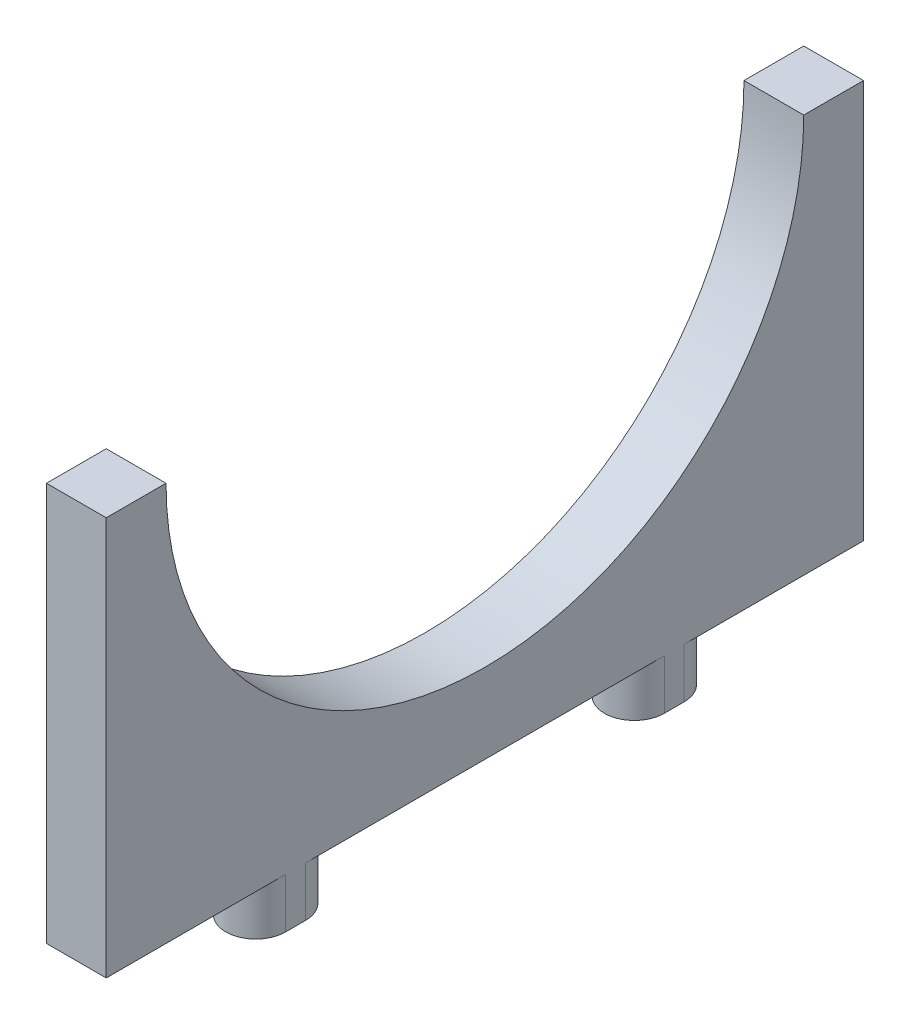
ISO-10303-21;
HEADER;
FILE_DESCRIPTION(('STEP AP214'),'2;1');
FILE_NAME('part.step','',(''),(''),'','','');
FILE_SCHEMA(('AUTOMOTIVE_DESIGN { 1 0 10303 214 1 1 1 1 }'));
ENDSEC;
DATA;
#1=APPLICATION_CONTEXT('core data for automotive mechanical design processes');
#2=APPLICATION_PROTOCOL_DEFINITION('international standard','automotive_design',2000,#1);
#3=PRODUCT_CONTEXT('',#1,'mechanical');
#4=PRODUCT('Part','Part','',(#3));
#5=PRODUCT_RELATED_PRODUCT_CATEGORY('part','',(#4));
#6=PRODUCT_DEFINITION_FORMATION('','',#4);
#7=PRODUCT_DEFINITION_CONTEXT('part definition',#1,'design');
#8=PRODUCT_DEFINITION('design','',#6,#7);
#9=PRODUCT_DEFINITION_SHAPE('','',#8);
#10=(LENGTH_UNIT() NAMED_UNIT(*) SI_UNIT(.MILLI.,.METRE.));
#11=(NAMED_UNIT(*) PLANE_ANGLE_UNIT() SI_UNIT($,.RADIAN.));
#12=(NAMED_UNIT(*) SI_UNIT($,.STERADIAN.) SOLID_ANGLE_UNIT());
#13=UNCERTAINTY_MEASURE_WITH_UNIT(LENGTH_MEASURE(1.E-05),#10,'distance_accuracy_value','');
#14=(GEOMETRIC_REPRESENTATION_CONTEXT(3) GLOBAL_UNCERTAINTY_ASSIGNED_CONTEXT((#13)) GLOBAL_UNIT_ASSIGNED_CONTEXT((#10,
#11,#12)) REPRESENTATION_CONTEXT('',''));
#15=CARTESIAN_POINT('',(0.,0.,0.));
#16=DIRECTION('',(0.,0.,1.));
#17=DIRECTION('',(1.,0.,0.));
#18=AXIS2_PLACEMENT_3D('',#15,#16,#17);
#19=CARTESIAN_POINT('',(6.,-40.,38.));
#20=DIRECTION('',(0.,1.,0.));
#21=DIRECTION('',(0.,0.,1.));
#22=AXIS2_PLACEMENT_3D('',#19,#20,#21);
#23=PLANE('',#22);
#24=CARTESIAN_POINT('',(3.,-40.,-20.));
#25=DIRECTION('',(0.,-1.,0.));
#26=DIRECTION('',(0.,0.,-1.));
#27=AXIS2_PLACEMENT_3D('',#24,#25,#26);
#28=CIRCLE('',#27,3.);
#29=CARTESIAN_POINT('',(0.,-40.,-20.));
#30=VERTEX_POINT('',#29);
#31=CARTESIAN_POINT('',(6.,-40.,-20.));
#32=VERTEX_POINT('',#31);
#33=EDGE_CURVE('E156',#30,#32,#28,.T.);
#34=ORIENTED_EDGE('',*,*,#33,.F.);
#35=DIRECTION('',(0.,0.,-1.));
#36=VECTOR('',#35,1.);
#37=CARTESIAN_POINT('',(0.,-40.,38.));
#38=LINE('',#37,#36);
#39=CARTESIAN_POINT('',(0.,-40.,-38.));
#40=VERTEX_POINT('',#39);
#41=EDGE_CURVE('E208',#30,#40,#38,.T.);
#42=ORIENTED_EDGE('',*,*,#41,.T.);
#43=DIRECTION('',(-1.,0.,0.));
#44=VECTOR('',#43,1.);
#45=CARTESIAN_POINT('',(6.,-40.,-38.));
#46=LINE('',#45,#44);
#47=CARTESIAN_POINT('',(6.,-40.,-38.));
#48=VERTEX_POINT('',#47);
#49=EDGE_CURVE('E40',#48,#40,#46,.T.);
#50=ORIENTED_EDGE('',*,*,#49,.F.);
#51=DIRECTION('',(0.,0.,-1.));
#52=VECTOR('',#51,1.);
#53=CARTESIAN_POINT('',(6.,-40.,38.));
#54=LINE('',#53,#52);
#55=EDGE_CURVE('E47',#32,#48,#54,.T.);
#56=ORIENTED_EDGE('',*,*,#55,.F.);
#57=EDGE_LOOP('',(#34,#42,#50,#56));
#58=FACE_BOUND('',#57,.T.);
#59=ADVANCED_FACE('F32',(#58),#23,.F.);
#60=CARTESIAN_POINT('',(3.,-40.,-18.));
#61=DIRECTION('',(0.,-1.,0.));
#62=DIRECTION('',(0.,0.,-1.));
#63=AXIS2_PLACEMENT_3D('',#60,#61,#62);
#64=CIRCLE('',#63,3.);
#65=CARTESIAN_POINT('',(6.,-40.,-18.));
#66=VERTEX_POINT('',#65);
#67=CARTESIAN_POINT('',(0.,-40.,-18.));
#68=VERTEX_POINT('',#67);
#69=EDGE_CURVE('E55',#66,#68,#64,.T.);
#70=ORIENTED_EDGE('',*,*,#69,.F.);
#71=CARTESIAN_POINT('',(6.,-40.,18.));
#72=VERTEX_POINT('',#71);
#73=EDGE_CURVE('E197',#72,#66,#54,.T.);
#74=ORIENTED_EDGE('',*,*,#73,.F.);
#75=CARTESIAN_POINT('',(3.,-40.,18.));
#76=DIRECTION('',(0.,-1.,0.));
#77=DIRECTION('',(0.,0.,-1.));
#78=AXIS2_PLACEMENT_3D('',#75,#76,#77);
#79=CIRCLE('',#78,3.);
#80=CARTESIAN_POINT('',(0.,-40.,18.));
#81=VERTEX_POINT('',#80);
#82=EDGE_CURVE('E157',#81,#72,#79,.T.);
#83=ORIENTED_EDGE('',*,*,#82,.F.);
#84=EDGE_CURVE('E212',#81,#68,#38,.T.);
#85=ORIENTED_EDGE('',*,*,#84,.T.);
#86=EDGE_LOOP('',(#70,#74,#83,#85));
#87=FACE_BOUND('',#86,.T.);
#88=ADVANCED_FACE('F292',(#87),#23,.F.);
#89=CARTESIAN_POINT('',(6.,0.,38.));
#90=DIRECTION('',(0.,0.,-1.));
#91=DIRECTION('',(0.,1.,0.));
#92=AXIS2_PLACEMENT_3D('',#89,#90,#91);
#93=PLANE('',#92);
#94=DIRECTION('',(0.,-1.,0.));
#95=VECTOR('',#94,1.);
#96=CARTESIAN_POINT('',(0.,0.,38.));
#97=LINE('',#96,#95);
#98=CARTESIAN_POINT('',(0.,0.,38.));
#99=VERTEX_POINT('',#98);
#100=CARTESIAN_POINT('',(0.,-40.,38.));
#101=VERTEX_POINT('',#100);
#102=EDGE_CURVE('E189',#99,#101,#97,.T.);
#103=ORIENTED_EDGE('',*,*,#102,.T.);
#104=DIRECTION('',(-1.,0.,0.));
#105=VECTOR('',#104,1.);
#106=CARTESIAN_POINT('',(6.,-40.,38.));
#107=LINE('',#106,#105);
#108=CARTESIAN_POINT('',(6.,-40.,38.));
#109=VERTEX_POINT('',#108);
#110=EDGE_CURVE('E11',#109,#101,#107,.T.);
#111=ORIENTED_EDGE('',*,*,#110,.F.);
#112=DIRECTION('',(0.,-1.,0.));
#113=VECTOR('',#112,1.);
#114=CARTESIAN_POINT('',(6.,0.,38.));
#115=LINE('',#114,#113);
#116=CARTESIAN_POINT('',(6.,0.,38.));
#117=VERTEX_POINT('',#116);
#118=EDGE_CURVE('E190',#117,#109,#115,.T.);
#119=ORIENTED_EDGE('',*,*,#118,.F.);
#120=DIRECTION('',(-1.,0.,0.));
#121=VECTOR('',#120,1.);
#122=CARTESIAN_POINT('',(6.,0.,38.));
#123=LINE('',#122,#121);
#124=EDGE_CURVE('E205',#117,#99,#123,.T.);
#125=ORIENTED_EDGE('',*,*,#124,.T.);
#126=EDGE_LOOP('',(#103,#111,#119,#125));
#127=FACE_BOUND('',#126,.T.);
#128=ADVANCED_FACE('F34',(#127),#93,.F.);
#129=CARTESIAN_POINT('',(3.,-40.,20.));
#130=DIRECTION('',(0.,-1.,0.));
#131=DIRECTION('',(0.,0.,-1.));
#132=AXIS2_PLACEMENT_3D('',#129,#130,#131);
#133=CIRCLE('',#132,3.);
#134=CARTESIAN_POINT('',(6.,-40.,20.));
#135=VERTEX_POINT('',#134);
#136=CARTESIAN_POINT('',(0.,-40.,20.));
#137=VERTEX_POINT('',#136);
#138=EDGE_CURVE('E160',#135,#137,#133,.T.);
#139=ORIENTED_EDGE('',*,*,#138,.F.);
#140=EDGE_CURVE('E193',#109,#135,#54,.T.);
#141=ORIENTED_EDGE('',*,*,#140,.F.);
#142=ORIENTED_EDGE('',*,*,#110,.T.);
#143=EDGE_CURVE('E209',#101,#137,#38,.T.);
#144=ORIENTED_EDGE('',*,*,#143,.T.);
#145=EDGE_LOOP('',(#139,#141,#142,#144));
#146=FACE_BOUND('',#145,.T.);
#147=ADVANCED_FACE('F276',(#146),#23,.F.);
#148=CARTESIAN_POINT('',(6.,0.,-38.));
#149=DIRECTION('',(0.,0.,1.));
#150=DIRECTION('',(0.,-1.,0.));
#151=AXIS2_PLACEMENT_3D('',#148,#149,#150);
#152=PLANE('',#151);
#153=DIRECTION('',(0.,1.,0.));
#154=VECTOR('',#153,1.);
#155=CARTESIAN_POINT('',(0.,0.,-38.));
#156=LINE('',#155,#154);
#157=CARTESIAN_POINT('',(0.,0.,-38.));
#158=VERTEX_POINT('',#157);
#159=EDGE_CURVE('E211',#40,#158,#156,.T.);
#160=ORIENTED_EDGE('',*,*,#159,.T.);
#161=DIRECTION('',(-1.,0.,0.));
#162=VECTOR('',#161,1.);
#163=CARTESIAN_POINT('',(6.,0.,-38.));
#164=LINE('',#163,#162);
#165=CARTESIAN_POINT('',(6.,0.,-38.));
#166=VERTEX_POINT('',#165);
#167=EDGE_CURVE('E227',#166,#158,#164,.T.);
#168=ORIENTED_EDGE('',*,*,#167,.F.);
#169=DIRECTION('',(0.,1.,0.));
#170=VECTOR('',#169,1.);
#171=CARTESIAN_POINT('',(6.,0.,-38.));
#172=LINE('',#171,#170);
#173=EDGE_CURVE('E196',#48,#166,#172,.T.);
#174=ORIENTED_EDGE('',*,*,#173,.F.);
#175=ORIENTED_EDGE('',*,*,#49,.T.);
#176=EDGE_LOOP('',(#160,#168,#174,#175));
#177=FACE_BOUND('',#176,.T.);
#178=ADVANCED_FACE('F233',(#177),#152,.F.);
#179=CARTESIAN_POINT('',(6.,0.,-32.));
#180=DIRECTION('',(0.,-1.,0.));
#181=DIRECTION('',(0.,0.,-1.));
#182=AXIS2_PLACEMENT_3D('',#179,#180,#181);
#183=PLANE('',#182);
#184=DIRECTION('',(0.,0.,1.));
#185=VECTOR('',#184,1.);
#186=CARTESIAN_POINT('',(0.,0.,-32.));
#187=LINE('',#186,#185);
#188=CARTESIAN_POINT('',(0.,0.,-32.));
#189=VERTEX_POINT('',#188);
#190=EDGE_CURVE('E214',#158,#189,#187,.T.);
#191=ORIENTED_EDGE('',*,*,#190,.T.);
#192=DIRECTION('',(-1.,0.,0.));
#193=VECTOR('',#192,1.);
#194=CARTESIAN_POINT('',(6.,0.,-32.));
#195=LINE('',#194,#193);
#196=CARTESIAN_POINT('',(6.,0.,-32.));
#197=VERTEX_POINT('',#196);
#198=EDGE_CURVE('E224',#197,#189,#195,.T.);
#199=ORIENTED_EDGE('',*,*,#198,.F.);
#200=DIRECTION('',(0.,0.,1.));
#201=VECTOR('',#200,1.);
#202=CARTESIAN_POINT('',(6.,0.,-32.));
#203=LINE('',#202,#201);
#204=EDGE_CURVE('E199',#166,#197,#203,.T.);
#205=ORIENTED_EDGE('',*,*,#204,.F.);
#206=ORIENTED_EDGE('',*,*,#167,.T.);
#207=EDGE_LOOP('',(#191,#199,#205,#206));
#208=FACE_BOUND('',#207,.T.);
#209=ADVANCED_FACE('F243',(#208),#183,.F.);
#210=CARTESIAN_POINT('',(6.,0.,0.));
#211=DIRECTION('',(-1.,0.,0.));
#212=DIRECTION('',(0.,0.,1.));
#213=AXIS2_PLACEMENT_3D('',#210,#211,#212);
#214=CYLINDRICAL_SURFACE('',#213,32.);
#215=CARTESIAN_POINT('',(0.,0.,0.));
#216=DIRECTION('',(-1.,0.,0.));
#217=DIRECTION('',(0.,0.,-1.));
#218=AXIS2_PLACEMENT_3D('',#215,#216,#217);
#219=CIRCLE('',#218,32.);
#220=CARTESIAN_POINT('',(0.,0.,32.));
#221=VERTEX_POINT('',#220);
#222=EDGE_CURVE('E216',#189,#221,#219,.T.);
#223=ORIENTED_EDGE('',*,*,#222,.T.);
#224=DIRECTION('',(-1.,0.,0.));
#225=VECTOR('',#224,1.);
#226=CARTESIAN_POINT('',(6.,0.,32.));
#227=LINE('',#226,#225);
#228=CARTESIAN_POINT('',(6.,0.,32.));
#229=VERTEX_POINT('',#228);
#230=EDGE_CURVE('E221',#229,#221,#227,.T.);
#231=ORIENTED_EDGE('',*,*,#230,.F.);
#232=CARTESIAN_POINT('',(6.,0.,0.));
#233=DIRECTION('',(-1.,0.,0.));
#234=DIRECTION('',(0.,0.,-1.));
#235=AXIS2_PLACEMENT_3D('',#232,#233,#234);
#236=CIRCLE('',#235,32.);
#237=EDGE_CURVE('E201',#197,#229,#236,.T.);
#238=ORIENTED_EDGE('',*,*,#237,.F.);
#239=ORIENTED_EDGE('',*,*,#198,.T.);
#240=EDGE_LOOP('',(#223,#231,#238,#239));
#241=FACE_BOUND('',#240,.T.);
#242=ADVANCED_FACE('F247',(#241),#214,.F.);
#243=CARTESIAN_POINT('',(6.,0.,38.));
#244=DIRECTION('',(0.,-1.,0.));
#245=DIRECTION('',(0.,0.,-1.));
#246=AXIS2_PLACEMENT_3D('',#243,#244,#245);
#247=PLANE('',#246);
#248=DIRECTION('',(0.,0.,1.));
#249=VECTOR('',#248,1.);
#250=CARTESIAN_POINT('',(0.,0.,38.));
#251=LINE('',#250,#249);
#252=EDGE_CURVE('E192',#221,#99,#251,.T.);
#253=ORIENTED_EDGE('',*,*,#252,.T.);
#254=ORIENTED_EDGE('',*,*,#124,.F.);
#255=DIRECTION('',(0.,0.,1.));
#256=VECTOR('',#255,1.);
#257=CARTESIAN_POINT('',(6.,0.,38.));
#258=LINE('',#257,#256);
#259=EDGE_CURVE('E203',#229,#117,#258,.T.);
#260=ORIENTED_EDGE('',*,*,#259,.F.);
#261=ORIENTED_EDGE('',*,*,#230,.T.);
#262=EDGE_LOOP('',(#253,#254,#260,#261));
#263=FACE_BOUND('',#262,.T.);
#264=ADVANCED_FACE('F281',(#263),#247,.F.);
#265=CARTESIAN_POINT('',(6.,0.,0.));
#266=DIRECTION('',(1.,0.,0.));
#267=DIRECTION('',(0.,0.,-1.));
#268=AXIS2_PLACEMENT_3D('',#265,#266,#267);
#269=PLANE('',#268);
#270=ORIENTED_EDGE('',*,*,#118,.T.);
#271=ORIENTED_EDGE('',*,*,#140,.T.);
#272=DIRECTION('',(0.,1.,0.));
#273=VECTOR('',#272,1.);
#274=CARTESIAN_POINT('',(6.,-45.,20.));
#275=LINE('',#274,#273);
#276=CARTESIAN_POINT('',(6.,-45.,20.));
#277=VERTEX_POINT('',#276);
#278=EDGE_CURVE('E183',#277,#135,#275,.T.);
#279=ORIENTED_EDGE('',*,*,#278,.F.);
#280=DIRECTION('',(0.,0.,1.));
#281=VECTOR('',#280,1.);
#282=CARTESIAN_POINT('',(6.,-45.,20.));
#283=LINE('',#282,#281);
#284=CARTESIAN_POINT('',(6.,-45.,18.));
#285=VERTEX_POINT('',#284);
#286=EDGE_CURVE('E169',#285,#277,#283,.T.);
#287=ORIENTED_EDGE('',*,*,#286,.F.);
#288=DIRECTION('',(0.,1.,0.));
#289=VECTOR('',#288,1.);
#290=CARTESIAN_POINT('',(6.,-45.,18.));
#291=LINE('',#290,#289);
#292=EDGE_CURVE('E186',#285,#72,#291,.T.);
#293=ORIENTED_EDGE('',*,*,#292,.T.);
#294=ORIENTED_EDGE('',*,*,#73,.T.);
#295=DIRECTION('',(0.,1.,0.));
#296=VECTOR('',#295,1.);
#297=CARTESIAN_POINT('',(6.,-45.,-18.));
#298=LINE('',#297,#296);
#299=CARTESIAN_POINT('',(6.,-45.,-18.));
#300=VERTEX_POINT('',#299);
#301=EDGE_CURVE('E141',#300,#66,#298,.T.);
#302=ORIENTED_EDGE('',*,*,#301,.F.);
#303=DIRECTION('',(0.,0.,1.));
#304=VECTOR('',#303,1.);
#305=CARTESIAN_POINT('',(6.,-45.,-18.));
#306=LINE('',#305,#304);
#307=CARTESIAN_POINT('',(6.,-45.,-20.));
#308=VERTEX_POINT('',#307);
#309=EDGE_CURVE('E133',#308,#300,#306,.T.);
#310=ORIENTED_EDGE('',*,*,#309,.F.);
#311=DIRECTION('',(0.,1.,0.));
#312=VECTOR('',#311,1.);
#313=CARTESIAN_POINT('',(6.,-45.,-20.));
#314=LINE('',#313,#312);
#315=EDGE_CURVE('E138',#308,#32,#314,.T.);
#316=ORIENTED_EDGE('',*,*,#315,.T.);
#317=ORIENTED_EDGE('',*,*,#55,.T.);
#318=ORIENTED_EDGE('',*,*,#173,.T.);
#319=ORIENTED_EDGE('',*,*,#204,.T.);
#320=ORIENTED_EDGE('',*,*,#237,.T.);
#321=ORIENTED_EDGE('',*,*,#259,.T.);
#322=EDGE_LOOP('',(#270,#271,#279,#287,#293,#294,#302,#310,#316,#317,#318,#319,#320,#321));
#323=FACE_BOUND('',#322,.T.);
#324=ADVANCED_FACE('F136',(#323),#269,.T.);
#325=CARTESIAN_POINT('',(0.,0.,0.));
#326=DIRECTION('',(1.,0.,0.));
#327=DIRECTION('',(0.,0.,-1.));
#328=AXIS2_PLACEMENT_3D('',#325,#326,#327);
#329=PLANE('',#328);
#330=ORIENTED_EDGE('',*,*,#102,.F.);
#331=ORIENTED_EDGE('',*,*,#252,.F.);
#332=ORIENTED_EDGE('',*,*,#222,.F.);
#333=ORIENTED_EDGE('',*,*,#190,.F.);
#334=ORIENTED_EDGE('',*,*,#159,.F.);
#335=ORIENTED_EDGE('',*,*,#41,.F.);
#336=DIRECTION('',(0.,1.,0.));
#337=VECTOR('',#336,1.);
#338=CARTESIAN_POINT('',(0.,-45.,-20.));
#339=LINE('',#338,#337);
#340=CARTESIAN_POINT('',(0.,-45.,-20.));
#341=VERTEX_POINT('',#340);
#342=EDGE_CURVE('E257',#341,#30,#339,.T.);
#343=ORIENTED_EDGE('',*,*,#342,.F.);
#344=DIRECTION('',(0.,0.,-1.));
#345=VECTOR('',#344,1.);
#346=CARTESIAN_POINT('',(0.,-45.,-18.));
#347=LINE('',#346,#345);
#348=CARTESIAN_POINT('',(0.,-45.,-18.));
#349=VERTEX_POINT('',#348);
#350=EDGE_CURVE('E150',#349,#341,#347,.T.);
#351=ORIENTED_EDGE('',*,*,#350,.F.);
#352=DIRECTION('',(0.,1.,0.));
#353=VECTOR('',#352,1.);
#354=CARTESIAN_POINT('',(0.,-45.,-18.));
#355=LINE('',#354,#353);
#356=EDGE_CURVE('E162',#349,#68,#355,.T.);
#357=ORIENTED_EDGE('',*,*,#356,.T.);
#358=ORIENTED_EDGE('',*,*,#84,.F.);
#359=DIRECTION('',(0.,1.,0.));
#360=VECTOR('',#359,1.);
#361=CARTESIAN_POINT('',(0.,-45.,18.));
#362=LINE('',#361,#360);
#363=CARTESIAN_POINT('',(0.,-45.,18.));
#364=VERTEX_POINT('',#363);
#365=EDGE_CURVE('E174',#364,#81,#362,.T.);
#366=ORIENTED_EDGE('',*,*,#365,.F.);
#367=DIRECTION('',(0.,0.,-1.));
#368=VECTOR('',#367,1.);
#369=CARTESIAN_POINT('',(0.,-45.,20.));
#370=LINE('',#369,#368);
#371=CARTESIAN_POINT('',(0.,-45.,20.));
#372=VERTEX_POINT('',#371);
#373=EDGE_CURVE('E173',#372,#364,#370,.T.);
#374=ORIENTED_EDGE('',*,*,#373,.F.);
#375=DIRECTION('',(0.,1.,0.));
#376=VECTOR('',#375,1.);
#377=CARTESIAN_POINT('',(0.,-45.,20.));
#378=LINE('',#377,#376);
#379=EDGE_CURVE('E180',#372,#137,#378,.T.);
#380=ORIENTED_EDGE('',*,*,#379,.T.);
#381=ORIENTED_EDGE('',*,*,#143,.F.);
#382=EDGE_LOOP('',(#330,#331,#332,#333,#334,#335,#343,#351,#357,#358,#366,#374,#380,#381));
#383=FACE_BOUND('',#382,.T.);
#384=ADVANCED_FACE('F238',(#383),#329,.F.);
#385=CARTESIAN_POINT('',(3.,-45.,18.));
#386=DIRECTION('',(0.,1.,0.));
#387=DIRECTION('',(0.,0.,1.));
#388=AXIS2_PLACEMENT_3D('',#385,#386,#387);
#389=CYLINDRICAL_SURFACE('',#388,3.);
#390=ORIENTED_EDGE('',*,*,#82,.T.);
#391=ORIENTED_EDGE('',*,*,#292,.F.);
#392=CARTESIAN_POINT('',(3.,-45.,18.));
#393=DIRECTION('',(0.,-1.,0.));
#394=DIRECTION('',(0.,0.,-1.));
#395=AXIS2_PLACEMENT_3D('',#392,#393,#394);
#396=CIRCLE('',#395,3.);
#397=EDGE_CURVE('E166',#364,#285,#396,.T.);
#398=ORIENTED_EDGE('',*,*,#397,.F.);
#399=ORIENTED_EDGE('',*,*,#365,.T.);
#400=EDGE_LOOP('',(#390,#391,#398,#399));
#401=FACE_BOUND('',#400,.T.);
#402=ADVANCED_FACE('F267',(#401),#389,.T.);
#403=CARTESIAN_POINT('',(3.,-45.,20.));
#404=DIRECTION('',(0.,1.,0.));
#405=DIRECTION('',(0.,0.,1.));
#406=AXIS2_PLACEMENT_3D('',#403,#404,#405);
#407=CYLINDRICAL_SURFACE('',#406,3.);
#408=ORIENTED_EDGE('',*,*,#138,.T.);
#409=ORIENTED_EDGE('',*,*,#379,.F.);
#410=CARTESIAN_POINT('',(3.,-45.,20.));
#411=DIRECTION('',(0.,-1.,0.));
#412=DIRECTION('',(0.,0.,-1.));
#413=AXIS2_PLACEMENT_3D('',#410,#411,#412);
#414=CIRCLE('',#413,3.);
#415=EDGE_CURVE('E171',#277,#372,#414,.T.);
#416=ORIENTED_EDGE('',*,*,#415,.F.);
#417=ORIENTED_EDGE('',*,*,#278,.T.);
#418=EDGE_LOOP('',(#408,#409,#416,#417));
#419=FACE_BOUND('',#418,.T.);
#420=ADVANCED_FACE('F274',(#419),#407,.T.);
#421=CARTESIAN_POINT('',(3.,-45.,18.));
#422=DIRECTION('',(0.,-1.,0.));
#423=DIRECTION('',(0.,0.,-1.));
#424=AXIS2_PLACEMENT_3D('',#421,#422,#423);
#425=PLANE('',#424);
#426=ORIENTED_EDGE('',*,*,#397,.T.);
#427=ORIENTED_EDGE('',*,*,#286,.T.);
#428=ORIENTED_EDGE('',*,*,#415,.T.);
#429=ORIENTED_EDGE('',*,*,#373,.T.);
#430=EDGE_LOOP('',(#426,#427,#428,#429));
#431=FACE_BOUND('',#430,.T.);
#432=ADVANCED_FACE('F269',(#431),#425,.T.);
#433=CARTESIAN_POINT('',(3.,-45.,-20.));
#434=DIRECTION('',(0.,1.,0.));
#435=DIRECTION('',(0.,0.,1.));
#436=AXIS2_PLACEMENT_3D('',#433,#434,#435);
#437=CYLINDRICAL_SURFACE('',#436,3.);
#438=ORIENTED_EDGE('',*,*,#33,.T.);
#439=ORIENTED_EDGE('',*,*,#315,.F.);
#440=CARTESIAN_POINT('',(3.,-45.,-20.));
#441=DIRECTION('',(0.,-1.,0.));
#442=DIRECTION('',(0.,0.,-1.));
#443=AXIS2_PLACEMENT_3D('',#440,#441,#442);
#444=CIRCLE('',#443,3.);
#445=EDGE_CURVE('E145',#341,#308,#444,.T.);
#446=ORIENTED_EDGE('',*,*,#445,.F.);
#447=ORIENTED_EDGE('',*,*,#342,.T.);
#448=EDGE_LOOP('',(#438,#439,#446,#447));
#449=FACE_BOUND('',#448,.T.);
#450=ADVANCED_FACE('F155',(#449),#437,.T.);
#451=CARTESIAN_POINT('',(3.,-45.,-18.));
#452=DIRECTION('',(0.,1.,0.));
#453=DIRECTION('',(0.,0.,1.));
#454=AXIS2_PLACEMENT_3D('',#451,#452,#453);
#455=CYLINDRICAL_SURFACE('',#454,3.);
#456=ORIENTED_EDGE('',*,*,#69,.T.);
#457=ORIENTED_EDGE('',*,*,#356,.F.);
#458=CARTESIAN_POINT('',(3.,-45.,-18.));
#459=DIRECTION('',(0.,-1.,0.));
#460=DIRECTION('',(0.,0.,-1.));
#461=AXIS2_PLACEMENT_3D('',#458,#459,#460);
#462=CIRCLE('',#461,3.);
#463=EDGE_CURVE('E144',#300,#349,#462,.T.);
#464=ORIENTED_EDGE('',*,*,#463,.F.);
#465=ORIENTED_EDGE('',*,*,#301,.T.);
#466=EDGE_LOOP('',(#456,#457,#464,#465));
#467=FACE_BOUND('',#466,.T.);
#468=ADVANCED_FACE('F253',(#467),#455,.T.);
#469=CARTESIAN_POINT('',(3.,-45.,-20.));
#470=DIRECTION('',(0.,-1.,0.));
#471=DIRECTION('',(0.,0.,-1.));
#472=AXIS2_PLACEMENT_3D('',#469,#470,#471);
#473=PLANE('',#472);
#474=ORIENTED_EDGE('',*,*,#445,.T.);
#475=ORIENTED_EDGE('',*,*,#309,.T.);
#476=ORIENTED_EDGE('',*,*,#463,.T.);
#477=ORIENTED_EDGE('',*,*,#350,.T.);
#478=EDGE_LOOP('',(#474,#475,#476,#477));
#479=FACE_BOUND('',#478,.T.);
#480=ADVANCED_FACE('F148',(#479),#473,.T.);
#481=CLOSED_SHELL('',(#59,#88,#128,#147,#178,#209,#242,#264,#324,#384,#402,#420,#432,#450,#468,#480));
#482=MANIFOLD_SOLID_BREP('B2',#481);
#483=ADVANCED_BREP_SHAPE_REPRESENTATION('',(#18,#482),#14);
#484=SHAPE_DEFINITION_REPRESENTATION(#9,#483);
ENDSEC;
END-ISO-10303-21;
